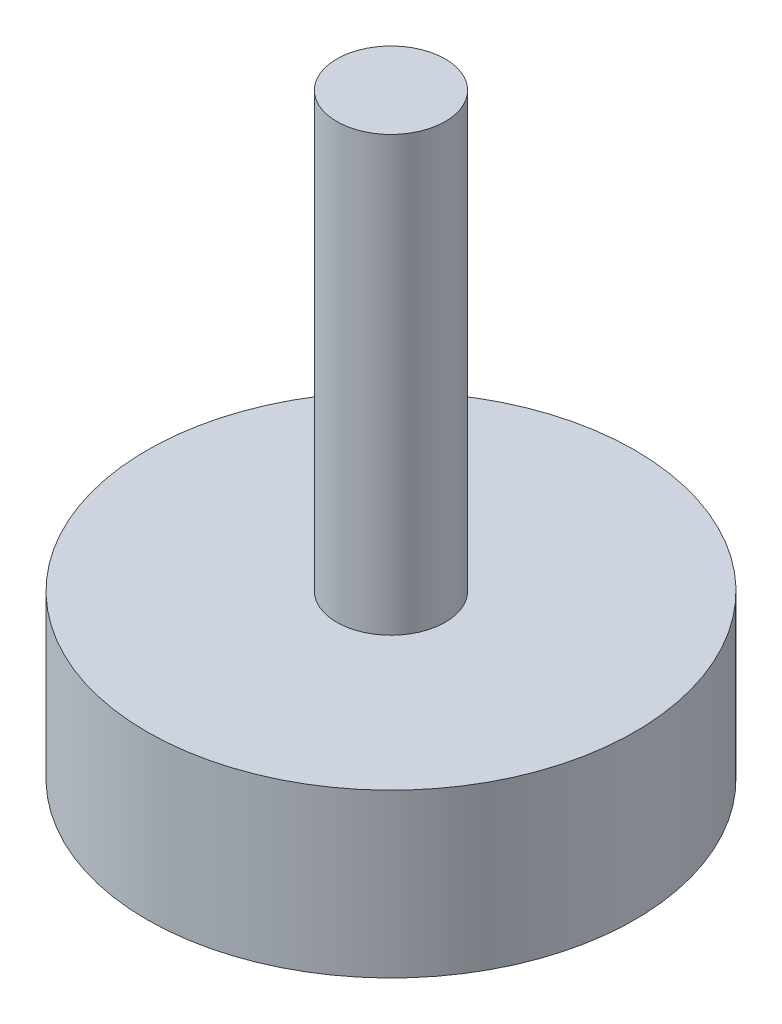
ISO-10303-21;
HEADER;
FILE_DESCRIPTION(('STEP AP214'),'2;1');
FILE_NAME('part.step','',(''),(''),'','','');
FILE_SCHEMA(('AUTOMOTIVE_DESIGN { 1 0 10303 214 1 1 1 1 }'));
ENDSEC;
DATA;
#1=APPLICATION_CONTEXT('core data for automotive mechanical design processes');
#2=APPLICATION_PROTOCOL_DEFINITION('international standard','automotive_design',2000,#1);
#3=PRODUCT_CONTEXT('',#1,'mechanical');
#4=PRODUCT('Part','Part','',(#3));
#5=PRODUCT_RELATED_PRODUCT_CATEGORY('part','',(#4));
#6=PRODUCT_DEFINITION_FORMATION('','',#4);
#7=PRODUCT_DEFINITION_CONTEXT('part definition',#1,'design');
#8=PRODUCT_DEFINITION('design','',#6,#7);
#9=PRODUCT_DEFINITION_SHAPE('','',#8);
#10=(LENGTH_UNIT() NAMED_UNIT(*) SI_UNIT(.MILLI.,.METRE.));
#11=(NAMED_UNIT(*) PLANE_ANGLE_UNIT() SI_UNIT($,.RADIAN.));
#12=(NAMED_UNIT(*) SI_UNIT($,.STERADIAN.) SOLID_ANGLE_UNIT());
#13=UNCERTAINTY_MEASURE_WITH_UNIT(LENGTH_MEASURE(1.E-05),#10,'distance_accuracy_value','');
#14=(GEOMETRIC_REPRESENTATION_CONTEXT(3) GLOBAL_UNCERTAINTY_ASSIGNED_CONTEXT((#13)) GLOBAL_UNIT_ASSIGNED_CONTEXT((#10,
#11,#12)) REPRESENTATION_CONTEXT('',''));
#15=CARTESIAN_POINT('',(0.,0.,0.));
#16=DIRECTION('',(0.,0.,1.));
#17=DIRECTION('',(1.,0.,0.));
#18=AXIS2_PLACEMENT_3D('',#15,#16,#17);
#19=CARTESIAN_POINT('',(0.,34.925,0.));
#20=DIRECTION('',(0.,1.,0.));
#21=DIRECTION('',(0.,0.,1.));
#22=AXIS2_PLACEMENT_3D('',#19,#20,#21);
#23=PLANE('',#22);
#24=CARTESIAN_POINT('',(0.,34.925,0.));
#25=DIRECTION('',(0.,-1.,0.));
#26=DIRECTION('',(0.,0.,-1.));
#27=AXIS2_PLACEMENT_3D('',#24,#25,#26);
#28=CIRCLE('',#27,3.175);
#29=CARTESIAN_POINT('',(0.,34.925,-3.175));
#30=VERTEX_POINT('',#29);
#31=EDGE_CURVE('E10',#30,#30,#28,.T.);
#32=ORIENTED_EDGE('',*,*,#31,.F.);
#33=EDGE_LOOP('',(#32));
#34=FACE_BOUND('',#33,.T.);
#35=ADVANCED_FACE('F34',(#34),#23,.T.);
#36=CARTESIAN_POINT('',(0.,9.525,0.));
#37=DIRECTION('',(0.,-1.,0.));
#38=DIRECTION('',(0.,0.,-1.));
#39=AXIS2_PLACEMENT_3D('',#36,#37,#38);
#40=CYLINDRICAL_SURFACE('',#39,3.175);
#41=ORIENTED_EDGE('',*,*,#31,.T.);
#42=EDGE_LOOP('',(#41));
#43=FACE_BOUND('',#42,.T.);
#44=CARTESIAN_POINT('',(0.,9.525,0.));
#45=DIRECTION('',(0.,-1.,0.));
#46=DIRECTION('',(0.,0.,-1.));
#47=AXIS2_PLACEMENT_3D('',#44,#45,#46);
#48=CIRCLE('',#47,3.175);
#49=CARTESIAN_POINT('',(0.,9.525,-3.175));
#50=VERTEX_POINT('',#49);
#51=EDGE_CURVE('E40',#50,#50,#48,.T.);
#52=ORIENTED_EDGE('',*,*,#51,.F.);
#53=EDGE_LOOP('',(#52));
#54=FACE_BOUND('',#53,.T.);
#55=ADVANCED_FACE('F66',(#43,#54),#40,.T.);
#56=CARTESIAN_POINT('',(-14.2875,0.,0.));
#57=DIRECTION('',(0.,-1.,0.));
#58=DIRECTION('',(0.,0.,-1.));
#59=AXIS2_PLACEMENT_3D('',#56,#57,#58);
#60=PLANE('',#59);
#61=CARTESIAN_POINT('',(0.,0.,0.));
#62=DIRECTION('',(0.,-1.,0.));
#63=DIRECTION('',(0.,0.,-1.));
#64=AXIS2_PLACEMENT_3D('',#61,#62,#63);
#65=CIRCLE('',#64,14.2875);
#66=CARTESIAN_POINT('',(0.,0.,-14.2875));
#67=VERTEX_POINT('',#66);
#68=EDGE_CURVE('E48',#67,#67,#65,.T.);
#69=ORIENTED_EDGE('',*,*,#68,.T.);
#70=EDGE_LOOP('',(#69));
#71=FACE_BOUND('',#70,.T.);
#72=ADVANCED_FACE('F54',(#71),#60,.T.);
#73=CARTESIAN_POINT('',(0.,9.525,0.));
#74=DIRECTION('',(0.,1.,0.));
#75=DIRECTION('',(0.,0.,1.));
#76=AXIS2_PLACEMENT_3D('',#73,#74,#75);
#77=PLANE('',#76);
#78=ORIENTED_EDGE('',*,*,#51,.T.);
#79=EDGE_LOOP('',(#78));
#80=FACE_BOUND('',#79,.T.);
#81=CARTESIAN_POINT('',(0.,9.525,0.));
#82=DIRECTION('',(0.,-1.,0.));
#83=DIRECTION('',(0.,0.,-1.));
#84=AXIS2_PLACEMENT_3D('',#81,#82,#83);
#85=CIRCLE('',#84,14.2875);
#86=CARTESIAN_POINT('',(0.,9.525,-14.2875));
#87=VERTEX_POINT('',#86);
#88=EDGE_CURVE('E44',#87,#87,#85,.T.);
#89=ORIENTED_EDGE('',*,*,#88,.F.);
#90=EDGE_LOOP('',(#89));
#91=FACE_BOUND('',#90,.T.);
#92=ADVANCED_FACE('F58',(#80,#91),#77,.T.);
#93=CARTESIAN_POINT('',(0.,0.,0.));
#94=DIRECTION('',(0.,-1.,0.));
#95=DIRECTION('',(0.,0.,-1.));
#96=AXIS2_PLACEMENT_3D('',#93,#94,#95);
#97=CYLINDRICAL_SURFACE('',#96,14.2875);
#98=ORIENTED_EDGE('',*,*,#88,.T.);
#99=EDGE_LOOP('',(#98));
#100=FACE_BOUND('',#99,.T.);
#101=ORIENTED_EDGE('',*,*,#68,.F.);
#102=EDGE_LOOP('',(#101));
#103=FACE_BOUND('',#102,.T.);
#104=ADVANCED_FACE('F56',(#100,#103),#97,.T.);
#105=CLOSED_SHELL('',(#35,#55,#72,#92,#104));
#106=MANIFOLD_SOLID_BREP('B2',#105);
#107=ADVANCED_BREP_SHAPE_REPRESENTATION('',(#18,#106),#14);
#108=SHAPE_DEFINITION_REPRESENTATION(#9,#107);
ENDSEC;
END-ISO-10303-21;
